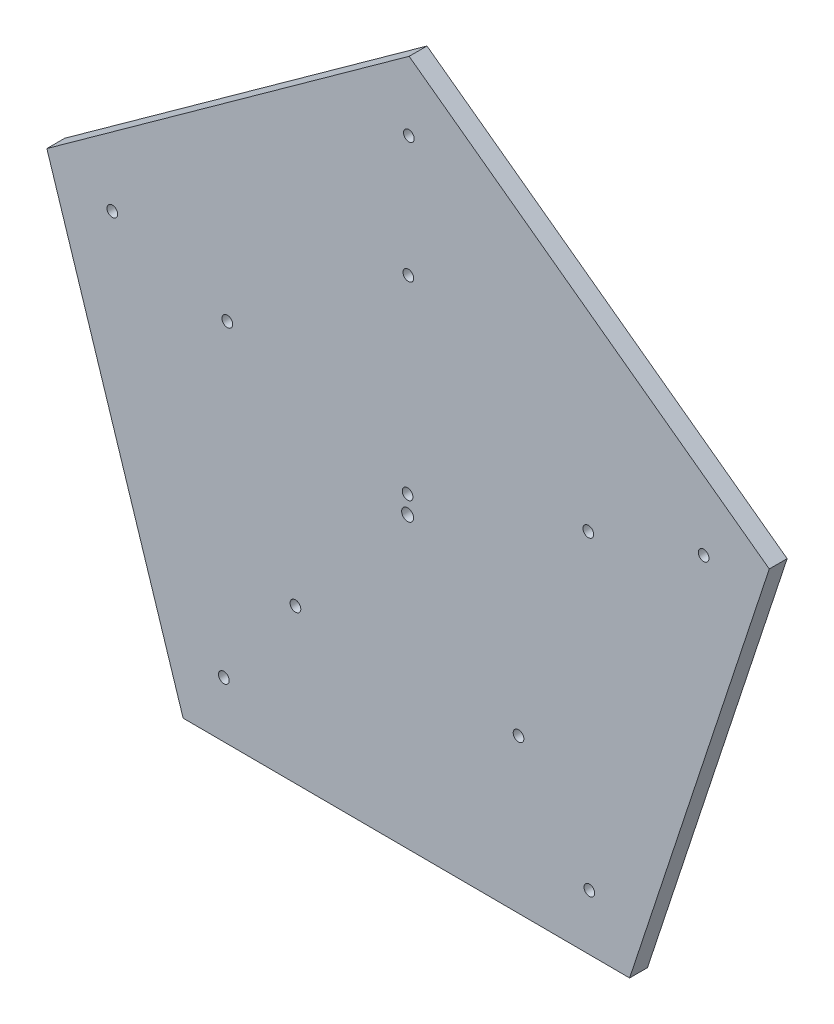
ISO-10303-21;
HEADER;
FILE_DESCRIPTION(('STEP AP214'),'2;1');
FILE_NAME('part.step','',(''),(''),'','','');
FILE_SCHEMA(('AUTOMOTIVE_DESIGN { 1 0 10303 214 1 1 1 1 }'));
ENDSEC;
DATA;
#1=APPLICATION_CONTEXT('core data for automotive mechanical design processes');
#2=APPLICATION_PROTOCOL_DEFINITION('international standard','automotive_design',2000,#1);
#3=PRODUCT_CONTEXT('',#1,'mechanical');
#4=PRODUCT('Part','Part','',(#3));
#5=PRODUCT_RELATED_PRODUCT_CATEGORY('part','',(#4));
#6=PRODUCT_DEFINITION_FORMATION('','',#4);
#7=PRODUCT_DEFINITION_CONTEXT('part definition',#1,'design');
#8=PRODUCT_DEFINITION('design','',#6,#7);
#9=PRODUCT_DEFINITION_SHAPE('','',#8);
#10=(LENGTH_UNIT() NAMED_UNIT(*) SI_UNIT(.MILLI.,.METRE.));
#11=(NAMED_UNIT(*) PLANE_ANGLE_UNIT() SI_UNIT($,.RADIAN.));
#12=(NAMED_UNIT(*) SI_UNIT($,.STERADIAN.) SOLID_ANGLE_UNIT());
#13=UNCERTAINTY_MEASURE_WITH_UNIT(LENGTH_MEASURE(1.E-05),#10,'distance_accuracy_value','');
#14=(GEOMETRIC_REPRESENTATION_CONTEXT(3) GLOBAL_UNCERTAINTY_ASSIGNED_CONTEXT((#13)) GLOBAL_UNIT_ASSIGNED_CONTEXT((#10,
#11,#12)) REPRESENTATION_CONTEXT('',''));
#15=CARTESIAN_POINT('',(0.,0.,0.));
#16=DIRECTION('',(0.,0.,1.));
#17=DIRECTION('',(1.,0.,0.));
#18=AXIS2_PLACEMENT_3D('',#15,#16,#17);
#19=CARTESIAN_POINT('',(60.7551531087886,19.4721535491955,3.));
#20=DIRECTION('',(-0.591017363980499,-0.806658834621888,0.));
#21=DIRECTION('',(0.806658834621888,-0.591017363980499,0.));
#22=AXIS2_PLACEMENT_3D('',#19,#20,#21);
#23=PLANE('',#22);
#24=DIRECTION('',(-0.806658834621888,0.591017363980499,0.));
#25=VECTOR('',#24,1.);
#26=CARTESIAN_POINT('',(60.7551531087886,19.4721535491955,0.));
#27=LINE('',#26,#25);
#28=CARTESIAN_POINT('',(60.7551531087886,19.4721535491955,0.));
#29=VERTEX_POINT('',#28);
#30=CARTESIAN_POINT('',(0.255256287205411,63.798810626403,0.));
#31=VERTEX_POINT('',#30);
#32=EDGE_CURVE('E107',#29,#31,#27,.T.);
#33=ORIENTED_EDGE('',*,*,#32,.T.);
#34=DIRECTION('',(0.,0.,-1.));
#35=VECTOR('',#34,1.);
#36=CARTESIAN_POINT('',(0.255256287205411,63.798810626403,3.));
#37=LINE('',#36,#35);
#38=CARTESIAN_POINT('',(0.255256287205411,63.798810626403,3.));
#39=VERTEX_POINT('',#38);
#40=EDGE_CURVE('E11',#39,#31,#37,.T.);
#41=ORIENTED_EDGE('',*,*,#40,.F.);
#42=DIRECTION('',(-0.806658834621888,0.591017363980499,0.));
#43=VECTOR('',#42,1.);
#44=CARTESIAN_POINT('',(60.7551531087886,19.4721535491955,3.));
#45=LINE('',#44,#43);
#46=CARTESIAN_POINT('',(60.7551531087886,19.4721535491955,3.));
#47=VERTEX_POINT('',#46);
#48=EDGE_CURVE('E116',#47,#39,#45,.T.);
#49=ORIENTED_EDGE('',*,*,#48,.F.);
#50=DIRECTION('',(0.,0.,-1.));
#51=VECTOR('',#50,1.);
#52=CARTESIAN_POINT('',(60.7551531087886,19.4721535491955,3.));
#53=LINE('',#52,#51);
#54=EDGE_CURVE('E103',#47,#29,#53,.T.);
#55=ORIENTED_EDGE('',*,*,#54,.T.);
#56=EDGE_LOOP('',(#33,#41,#49,#55));
#57=FACE_BOUND('',#56,.T.);
#58=ADVANCED_FACE('F33',(#57),#23,.F.);
#59=CARTESIAN_POINT('',(0.255256287205411,63.798810626403,3.));
#60=DIRECTION('',(0.584543731653543,-0.811362203818092,0.));
#61=DIRECTION('',(0.811362203818092,0.584543731653543,0.));
#62=AXIS2_PLACEMENT_3D('',#59,#60,#61);
#63=PLANE('',#62);
#64=DIRECTION('',(-0.811362203818092,-0.584543731653543,0.));
#65=VECTOR('',#64,1.);
#66=CARTESIAN_POINT('',(0.255256287205411,63.798810626403,0.));
#67=LINE('',#66,#65);
#68=CARTESIAN_POINT('',(-60.5973960474535,19.9576798597395,0.));
#69=VERTEX_POINT('',#68);
#70=EDGE_CURVE('E110',#31,#69,#67,.T.);
#71=ORIENTED_EDGE('',*,*,#70,.T.);
#72=DIRECTION('',(0.,0.,-1.));
#73=VECTOR('',#72,1.);
#74=CARTESIAN_POINT('',(-60.5973960474535,19.9576798597395,3.));
#75=LINE('',#74,#73);
#76=CARTESIAN_POINT('',(-60.5973960474535,19.9576798597395,3.));
#77=VERTEX_POINT('',#76);
#78=EDGE_CURVE('E41',#77,#69,#75,.T.);
#79=ORIENTED_EDGE('',*,*,#78,.F.);
#80=DIRECTION('',(-0.811362203818092,-0.584543731653543,0.));
#81=VECTOR('',#80,1.);
#82=CARTESIAN_POINT('',(0.255256287205411,63.798810626403,3.));
#83=LINE('',#82,#81);
#84=EDGE_CURVE('E83',#39,#77,#83,.T.);
#85=ORIENTED_EDGE('',*,*,#84,.F.);
#86=ORIENTED_EDGE('',*,*,#40,.T.);
#87=EDGE_LOOP('',(#71,#79,#85,#86));
#88=FACE_BOUND('',#87,.T.);
#89=ADVANCED_FACE('F137',(#88),#63,.F.);
#90=CARTESIAN_POINT('',(-60.5973960474535,19.9576798597395,3.));
#91=DIRECTION('',(0.952285258053086,0.305209415475287,0.));
#92=DIRECTION('',(-0.305209415475287,0.952285258053086,0.));
#93=AXIS2_PLACEMENT_3D('',#90,#91,#92);
#94=PLANE('',#93);
#95=DIRECTION('',(0.305209415475287,-0.952285258053087,0.));
#96=VECTOR('',#95,1.);
#97=CARTESIAN_POINT('',(-60.5973960474535,19.9576798597395,0.));
#98=LINE('',#97,#96);
#99=CARTESIAN_POINT('',(-37.7065066742702,-51.4642861364947,0.));
#100=VERTEX_POINT('',#99);
#101=EDGE_CURVE('E98',#69,#100,#98,.T.);
#102=ORIENTED_EDGE('',*,*,#101,.T.);
#103=DIRECTION('',(0.,0.,-1.));
#104=VECTOR('',#103,1.);
#105=CARTESIAN_POINT('',(-37.7065066742702,-51.4642861364947,3.));
#106=LINE('',#105,#104);
#107=CARTESIAN_POINT('',(-37.7065066742702,-51.4642861364947,3.));
#108=VERTEX_POINT('',#107);
#109=EDGE_CURVE('E95',#108,#100,#106,.T.);
#110=ORIENTED_EDGE('',*,*,#109,.F.);
#111=DIRECTION('',(0.305209415475287,-0.952285258053087,0.));
#112=VECTOR('',#111,1.);
#113=CARTESIAN_POINT('',(-60.5973960474535,19.9576798597395,3.));
#114=LINE('',#113,#112);
#115=EDGE_CURVE('E87',#77,#108,#114,.T.);
#116=ORIENTED_EDGE('',*,*,#115,.F.);
#117=ORIENTED_EDGE('',*,*,#78,.T.);
#118=EDGE_LOOP('',(#102,#110,#116,#117));
#119=FACE_BOUND('',#118,.T.);
#120=ADVANCED_FACE('F96',(#119),#94,.F.);
#121=CARTESIAN_POINT('',(-37.7065066742702,-51.4642861364947,3.));
#122=DIRECTION('',(0.00400092480872921,0.999991996268307,0.));
#123=DIRECTION('',(-0.999991996268308,0.00400092480872921,0.));
#124=AXIS2_PLACEMENT_3D('',#121,#122,#123);
#125=PLANE('',#124);
#126=DIRECTION('',(0.999991996268307,-0.00400092480872921,0.));
#127=VECTOR('',#126,1.);
#128=CARTESIAN_POINT('',(-37.7065066742702,-51.4642861364947,0.));
#129=LINE('',#128,#127);
#130=CARTESIAN_POINT('',(37.2934933257298,-51.7643578988433,0.));
#131=VERTEX_POINT('',#130);
#132=EDGE_CURVE('E69',#100,#131,#129,.T.);
#133=ORIENTED_EDGE('',*,*,#132,.T.);
#134=DIRECTION('',(0.,0.,-1.));
#135=VECTOR('',#134,1.);
#136=CARTESIAN_POINT('',(37.2934933257298,-51.7643578988433,3.));
#137=LINE('',#136,#135);
#138=CARTESIAN_POINT('',(37.2934933257298,-51.7643578988433,3.));
#139=VERTEX_POINT('',#138);
#140=EDGE_CURVE('E99',#139,#131,#137,.T.);
#141=ORIENTED_EDGE('',*,*,#140,.F.);
#142=DIRECTION('',(0.999991996268307,-0.00400092480872921,0.));
#143=VECTOR('',#142,1.);
#144=CARTESIAN_POINT('',(-37.7065066742702,-51.4642861364947,3.));
#145=LINE('',#144,#143);
#146=EDGE_CURVE('E91',#108,#139,#145,.T.);
#147=ORIENTED_EDGE('',*,*,#146,.F.);
#148=ORIENTED_EDGE('',*,*,#109,.T.);
#149=EDGE_LOOP('',(#133,#141,#147,#148));
#150=FACE_BOUND('',#149,.T.);
#151=ADVANCED_FACE('F101',(#150),#125,.F.);
#152=CARTESIAN_POINT('',(37.2934933257298,-51.7643578988433,3.));
#153=DIRECTION('',(-0.949812550534859,0.312819626696385,0.));
#154=DIRECTION('',(-0.312819626696385,-0.949812550534859,0.));
#155=AXIS2_PLACEMENT_3D('',#152,#153,#154);
#156=PLANE('',#155);
#157=DIRECTION('',(0.312819626696385,0.949812550534859,0.));
#158=VECTOR('',#157,1.);
#159=CARTESIAN_POINT('',(37.2934933257298,-51.7643578988433,0.));
#160=LINE('',#159,#158);
#161=EDGE_CURVE('E75',#131,#29,#160,.T.);
#162=ORIENTED_EDGE('',*,*,#161,.T.);
#163=ORIENTED_EDGE('',*,*,#54,.F.);
#164=DIRECTION('',(0.312819626696385,0.949812550534859,0.));
#165=VECTOR('',#164,1.);
#166=CARTESIAN_POINT('',(37.2934933257298,-51.7643578988433,3.));
#167=LINE('',#166,#165);
#168=EDGE_CURVE('E49',#139,#47,#167,.T.);
#169=ORIENTED_EDGE('',*,*,#168,.F.);
#170=ORIENTED_EDGE('',*,*,#140,.T.);
#171=EDGE_LOOP('',(#162,#163,#169,#170));
#172=FACE_BOUND('',#171,.T.);
#173=ADVANCED_FACE('F124',(#172),#156,.F.);
#174=CARTESIAN_POINT('',(0.,0.,3.));
#175=DIRECTION('',(0.,0.,1.));
#176=DIRECTION('',(1.,0.,0.));
#177=AXIS2_PLACEMENT_3D('',#174,#175,#176);
#178=PLANE('',#177);
#179=CARTESIAN_POINT('',(0.,-3.,3.));
#180=DIRECTION('',(0.,0.,-1.));
#181=DIRECTION('',(-1.,0.,0.));
#182=AXIS2_PLACEMENT_3D('',#179,#180,#181);
#183=CIRCLE('',#182,1.);
#184=CARTESIAN_POINT('',(-1.,-3.,3.));
#185=VERTEX_POINT('',#184);
#186=EDGE_CURVE('E291',#185,#185,#183,.T.);
#187=ORIENTED_EDGE('',*,*,#186,.T.);
#188=EDGE_LOOP('',(#187));
#189=FACE_BOUND('',#188,.T.);
#190=CARTESIAN_POINT('',(30.5267856348254,-42.3719881455068,3.));
#191=DIRECTION('',(0.,0.,1.));
#192=DIRECTION('',(0.309016994374945,0.951056516295155,0.));
#193=AXIS2_PLACEMENT_3D('',#190,#191,#192);
#194=CIRCLE('',#193,0.9);
#195=CARTESIAN_POINT('',(30.8049009297628,-41.5160372808412,3.));
#196=VERTEX_POINT('',#195);
#197=EDGE_CURVE('E303',#196,#196,#194,.T.);
#198=ORIENTED_EDGE('',*,*,#197,.F.);
#199=EDGE_LOOP('',(#198));
#200=FACE_BOUND('',#199,.T.);
#201=CARTESIAN_POINT('',(-30.2784703958275,9.97217798483106,3.));
#202=DIRECTION('',(0.,0.,1.));
#203=DIRECTION('',(0.309016994374958,-0.95105651629515,0.));
#204=AXIS2_PLACEMENT_3D('',#201,#202,#203);
#205=CIRCLE('',#204,0.900000000000001);
#206=CARTESIAN_POINT('',(-30.0003551008901,9.11622712016542,3.));
#207=VERTEX_POINT('',#206);
#208=EDGE_CURVE('E296',#207,#207,#205,.T.);
#209=ORIENTED_EDGE('',*,*,#208,.F.);
#210=EDGE_LOOP('',(#209));
#211=FACE_BOUND('',#210,.T.);
#212=CARTESIAN_POINT('',(-49.6023181044553,16.3364640991243,3.));
#213=DIRECTION('',(0.,0.,1.));
#214=DIRECTION('',(0.309016994374958,-0.95105651629515,0.));
#215=AXIS2_PLACEMENT_3D('',#212,#213,#214);
#216=CIRCLE('',#215,0.9);
#217=CARTESIAN_POINT('',(-49.3242028095178,15.4805132344587,3.));
#218=VERTEX_POINT('',#217);
#219=EDGE_CURVE('E317',#218,#218,#216,.T.);
#220=ORIENTED_EDGE('',*,*,#219,.F.);
#221=EDGE_LOOP('',(#220));
#222=FACE_BOUND('',#221,.T.);
#223=CARTESIAN_POINT('',(0.127542938139286,31.8781090416462,3.));
#224=DIRECTION('',(0.,0.,1.));
#225=DIRECTION('',(-0.809016994374942,-0.58778525229248,0.));
#226=AXIS2_PLACEMENT_3D('',#223,#224,#225);
#227=CIRCLE('',#226,0.900000000000001);
#228=CARTESIAN_POINT('',(-0.600572356798162,31.3491023145829,3.));
#229=VERTEX_POINT('',#228);
#230=EDGE_CURVE('E311',#229,#229,#227,.T.);
#231=ORIENTED_EDGE('',*,*,#230,.F.);
#232=EDGE_LOOP('',(#231));
#233=FACE_BOUND('',#232,.T.);
#234=CARTESIAN_POINT('',(18.6342979611836,-25.8648998213019,3.));
#235=DIRECTION('',(0.,0.,1.));
#236=DIRECTION('',(0.309016994374945,0.951056516295155,0.));
#237=AXIS2_PLACEMENT_3D('',#234,#235,#236);
#238=CIRCLE('',#237,0.900000000000001);
#239=CARTESIAN_POINT('',(18.9124132561211,-25.0089489566362,3.));
#240=VERTEX_POINT('',#239);
#241=EDGE_CURVE('E339',#240,#240,#238,.T.);
#242=ORIENTED_EDGE('',*,*,#241,.F.);
#243=EDGE_LOOP('',(#242));
#244=FACE_BOUND('',#243,.T.);
#245=CARTESIAN_POINT('',(49.7314509789673,15.9390339771307,3.));
#246=DIRECTION('',(0.,0.,1.));
#247=DIRECTION('',(-0.809016994374951,0.587785252292469,0.));
#248=AXIS2_PLACEMENT_3D('',#245,#246,#247);
#249=CIRCLE('',#248,0.9);
#250=CARTESIAN_POINT('',(49.0033356840298,16.4680407041939,3.));
#251=VERTEX_POINT('',#250);
#252=EDGE_CURVE('E328',#251,#251,#249,.T.);
#253=ORIENTED_EDGE('',*,*,#252,.F.);
#254=EDGE_LOOP('',(#253));
#255=FACE_BOUND('',#254,.T.);
#256=CARTESIAN_POINT('',(30.3572962666226,9.72957689998144,3.));
#257=DIRECTION('',(0.,0.,1.));
#258=DIRECTION('',(-0.809016994374951,0.587785252292469,0.));
#259=AXIS2_PLACEMENT_3D('',#256,#257,#258);
#260=CIRCLE('',#259,0.900000000000001);
#261=CARTESIAN_POINT('',(29.6291809716852,10.2585836270447,3.));
#262=VERTEX_POINT('',#261);
#263=EDGE_CURVE('E329',#262,#262,#260,.T.);
#264=ORIENTED_EDGE('',*,*,#263,.F.);
#265=EDGE_LOOP('',(#264));
#266=FACE_BOUND('',#265,.T.);
#267=CARTESIAN_POINT('',(0.208941380025352,52.2228528912129,3.));
#268=DIRECTION('',(0.,0.,1.));
#269=DIRECTION('',(-0.809016994374942,-0.58778525229248,0.));
#270=AXIS2_PLACEMENT_3D('',#267,#268,#269);
#271=CIRCLE('',#270,0.9);
#272=CARTESIAN_POINT('',(-0.519173914912096,51.6938461641496,3.));
#273=VERTEX_POINT('',#272);
#274=EDGE_CURVE('E310',#273,#273,#271,.T.);
#275=ORIENTED_EDGE('',*,*,#274,.F.);
#276=EDGE_LOOP('',(#275));
#277=FACE_BOUND('',#276,.T.);
#278=CARTESIAN_POINT('',(-30.8648598893633,-42.1263628219613,3.));
#279=DIRECTION('',(0.,0.,1.));
#280=DIRECTION('',(1.,0.,0.));
#281=AXIS2_PLACEMENT_3D('',#278,#279,#280);
#282=CIRCLE('',#281,0.9);
#283=CARTESIAN_POINT('',(-29.9648598893633,-42.1263628219613,3.));
#284=VERTEX_POINT('',#283);
#285=EDGE_CURVE('E351',#284,#284,#282,.T.);
#286=ORIENTED_EDGE('',*,*,#285,.F.);
#287=EDGE_LOOP('',(#286));
#288=FACE_BOUND('',#287,.T.);
#289=CARTESIAN_POINT('',(-18.8406667701184,-25.7149641051569,3.));
#290=DIRECTION('',(0.,0.,1.));
#291=DIRECTION('',(1.,0.,0.));
#292=AXIS2_PLACEMENT_3D('',#289,#290,#291);
#293=CIRCLE('',#292,0.900000000000001);
#294=CARTESIAN_POINT('',(-17.9406667701184,-25.7149641051569,3.));
#295=VERTEX_POINT('',#294);
#296=EDGE_CURVE('E354',#295,#295,#293,.T.);
#297=ORIENTED_EDGE('',*,*,#296,.F.);
#298=EDGE_LOOP('',(#297));
#299=FACE_BOUND('',#298,.T.);
#300=CARTESIAN_POINT('',(0.,0.,3.));
#301=DIRECTION('',(0.,0.,1.));
#302=DIRECTION('',(1.,0.,0.));
#303=AXIS2_PLACEMENT_3D('',#300,#301,#302);
#304=CIRCLE('',#303,0.9);
#305=CARTESIAN_POINT('',(0.9,0.,3.));
#306=VERTEX_POINT('',#305);
#307=EDGE_CURVE('E350',#306,#306,#304,.T.);
#308=ORIENTED_EDGE('',*,*,#307,.F.);
#309=EDGE_LOOP('',(#308));
#310=FACE_BOUND('',#309,.T.);
#311=ORIENTED_EDGE('',*,*,#48,.T.);
#312=ORIENTED_EDGE('',*,*,#84,.T.);
#313=ORIENTED_EDGE('',*,*,#115,.T.);
#314=ORIENTED_EDGE('',*,*,#146,.T.);
#315=ORIENTED_EDGE('',*,*,#168,.T.);
#316=EDGE_LOOP('',(#311,#312,#313,#314,#315));
#317=FACE_BOUND('',#316,.T.);
#318=ADVANCED_FACE('F89',(#189,#200,#211,#222,#233,#244,#255,#266,#277,#288,#299,#310,#317),
#178,.T.);
#319=CARTESIAN_POINT('',(0.,0.,0.));
#320=DIRECTION('',(0.,0.,1.));
#321=DIRECTION('',(1.,0.,0.));
#322=AXIS2_PLACEMENT_3D('',#319,#320,#321);
#323=PLANE('',#322);
#324=CARTESIAN_POINT('',(0.,-3.,0.));
#325=DIRECTION('',(0.,0.,-1.));
#326=DIRECTION('',(-1.,0.,0.));
#327=AXIS2_PLACEMENT_3D('',#324,#325,#326);
#328=CIRCLE('',#327,1.);
#329=CARTESIAN_POINT('',(-1.,-3.,0.));
#330=VERTEX_POINT('',#329);
#331=EDGE_CURVE('E294',#330,#330,#328,.T.);
#332=ORIENTED_EDGE('',*,*,#331,.F.);
#333=EDGE_LOOP('',(#332));
#334=FACE_BOUND('',#333,.T.);
#335=CARTESIAN_POINT('',(30.5267856348254,-42.3719881455068,0.));
#336=DIRECTION('',(0.,0.,1.));
#337=DIRECTION('',(0.309016994374945,0.951056516295155,0.));
#338=AXIS2_PLACEMENT_3D('',#335,#336,#337);
#339=CIRCLE('',#338,0.9);
#340=CARTESIAN_POINT('',(30.8049009297628,-41.5160372808412,0.));
#341=VERTEX_POINT('',#340);
#342=EDGE_CURVE('E299',#341,#341,#339,.T.);
#343=ORIENTED_EDGE('',*,*,#342,.T.);
#344=EDGE_LOOP('',(#343));
#345=FACE_BOUND('',#344,.T.);
#346=CARTESIAN_POINT('',(-30.2784703958275,9.97217798483106,0.));
#347=DIRECTION('',(0.,0.,1.));
#348=DIRECTION('',(0.309016994374958,-0.95105651629515,0.));
#349=AXIS2_PLACEMENT_3D('',#346,#347,#348);
#350=CIRCLE('',#349,0.900000000000001);
#351=CARTESIAN_POINT('',(-30.0003551008901,9.11622712016542,0.));
#352=VERTEX_POINT('',#351);
#353=EDGE_CURVE('E320',#352,#352,#350,.T.);
#354=ORIENTED_EDGE('',*,*,#353,.T.);
#355=EDGE_LOOP('',(#354));
#356=FACE_BOUND('',#355,.T.);
#357=CARTESIAN_POINT('',(-49.6023181044553,16.3364640991243,0.));
#358=DIRECTION('',(0.,0.,1.));
#359=DIRECTION('',(0.309016994374958,-0.95105651629515,0.));
#360=AXIS2_PLACEMENT_3D('',#357,#358,#359);
#361=CIRCLE('',#360,0.9);
#362=CARTESIAN_POINT('',(-49.3242028095178,15.4805132344587,0.));
#363=VERTEX_POINT('',#362);
#364=EDGE_CURVE('E314',#363,#363,#361,.T.);
#365=ORIENTED_EDGE('',*,*,#364,.T.);
#366=EDGE_LOOP('',(#365));
#367=FACE_BOUND('',#366,.T.);
#368=CARTESIAN_POINT('',(0.127542938139286,31.8781090416462,0.));
#369=DIRECTION('',(0.,0.,1.));
#370=DIRECTION('',(-0.809016994374942,-0.58778525229248,0.));
#371=AXIS2_PLACEMENT_3D('',#368,#369,#370);
#372=CIRCLE('',#371,0.900000000000001);
#373=CARTESIAN_POINT('',(-0.600572356798162,31.3491023145829,0.));
#374=VERTEX_POINT('',#373);
#375=EDGE_CURVE('E307',#374,#374,#372,.T.);
#376=ORIENTED_EDGE('',*,*,#375,.T.);
#377=EDGE_LOOP('',(#376));
#378=FACE_BOUND('',#377,.T.);
#379=CARTESIAN_POINT('',(18.6342979611836,-25.8648998213019,0.));
#380=DIRECTION('',(0.,0.,1.));
#381=DIRECTION('',(0.309016994374945,0.951056516295155,0.));
#382=AXIS2_PLACEMENT_3D('',#379,#380,#381);
#383=CIRCLE('',#382,0.900000000000001);
#384=CARTESIAN_POINT('',(18.9124132561211,-25.0089489566362,0.));
#385=VERTEX_POINT('',#384);
#386=EDGE_CURVE('E306',#385,#385,#383,.T.);
#387=ORIENTED_EDGE('',*,*,#386,.T.);
#388=EDGE_LOOP('',(#387));
#389=FACE_BOUND('',#388,.T.);
#390=CARTESIAN_POINT('',(49.7314509789673,15.9390339771307,0.));
#391=DIRECTION('',(0.,0.,1.));
#392=DIRECTION('',(-0.809016994374951,0.587785252292469,0.));
#393=AXIS2_PLACEMENT_3D('',#390,#391,#392);
#394=CIRCLE('',#393,0.9);
#395=CARTESIAN_POINT('',(49.0033356840298,16.4680407041939,0.));
#396=VERTEX_POINT('',#395);
#397=EDGE_CURVE('E342',#396,#396,#394,.T.);
#398=ORIENTED_EDGE('',*,*,#397,.T.);
#399=EDGE_LOOP('',(#398));
#400=FACE_BOUND('',#399,.T.);
#401=CARTESIAN_POINT('',(30.3572962666226,9.72957689998144,0.));
#402=DIRECTION('',(0.,0.,1.));
#403=DIRECTION('',(-0.809016994374951,0.587785252292469,0.));
#404=AXIS2_PLACEMENT_3D('',#401,#402,#403);
#405=CIRCLE('',#404,0.900000000000001);
#406=CARTESIAN_POINT('',(29.6291809716852,10.2585836270447,0.));
#407=VERTEX_POINT('',#406);
#408=EDGE_CURVE('E325',#407,#407,#405,.T.);
#409=ORIENTED_EDGE('',*,*,#408,.T.);
#410=EDGE_LOOP('',(#409));
#411=FACE_BOUND('',#410,.T.);
#412=CARTESIAN_POINT('',(0.208941380025352,52.2228528912129,0.));
#413=DIRECTION('',(0.,0.,1.));
#414=DIRECTION('',(-0.809016994374942,-0.58778525229248,0.));
#415=AXIS2_PLACEMENT_3D('',#412,#413,#414);
#416=CIRCLE('',#415,0.9);
#417=CARTESIAN_POINT('',(-0.519173914912096,51.6938461641496,0.));
#418=VERTEX_POINT('',#417);
#419=EDGE_CURVE('E332',#418,#418,#416,.T.);
#420=ORIENTED_EDGE('',*,*,#419,.T.);
#421=EDGE_LOOP('',(#420));
#422=FACE_BOUND('',#421,.T.);
#423=CARTESIAN_POINT('',(-30.8648598893633,-42.1263628219613,0.));
#424=DIRECTION('',(0.,0.,1.));
#425=DIRECTION('',(1.,0.,0.));
#426=AXIS2_PLACEMENT_3D('',#423,#424,#425);
#427=CIRCLE('',#426,0.9);
#428=CARTESIAN_POINT('',(-29.9648598893633,-42.1263628219613,0.));
#429=VERTEX_POINT('',#428);
#430=EDGE_CURVE('E347',#429,#429,#427,.T.);
#431=ORIENTED_EDGE('',*,*,#430,.T.);
#432=EDGE_LOOP('',(#431));
#433=FACE_BOUND('',#432,.T.);
#434=CARTESIAN_POINT('',(-18.8406667701184,-25.7149641051569,0.));
#435=DIRECTION('',(0.,0.,1.));
#436=DIRECTION('',(1.,0.,0.));
#437=AXIS2_PLACEMENT_3D('',#434,#435,#436);
#438=CIRCLE('',#437,0.900000000000001);
#439=CARTESIAN_POINT('',(-17.9406667701184,-25.7149641051569,0.));
#440=VERTEX_POINT('',#439);
#441=EDGE_CURVE('E302',#440,#440,#438,.T.);
#442=ORIENTED_EDGE('',*,*,#441,.T.);
#443=EDGE_LOOP('',(#442));
#444=FACE_BOUND('',#443,.T.);
#445=CARTESIAN_POINT('',(0.,0.,0.));
#446=DIRECTION('',(0.,0.,1.));
#447=DIRECTION('',(1.,0.,0.));
#448=AXIS2_PLACEMENT_3D('',#445,#446,#447);
#449=CIRCLE('',#448,0.9);
#450=CARTESIAN_POINT('',(0.9,0.,0.));
#451=VERTEX_POINT('',#450);
#452=EDGE_CURVE('E111',#451,#451,#449,.T.);
#453=ORIENTED_EDGE('',*,*,#452,.T.);
#454=EDGE_LOOP('',(#453));
#455=FACE_BOUND('',#454,.T.);
#456=ORIENTED_EDGE('',*,*,#32,.F.);
#457=ORIENTED_EDGE('',*,*,#161,.F.);
#458=ORIENTED_EDGE('',*,*,#132,.F.);
#459=ORIENTED_EDGE('',*,*,#101,.F.);
#460=ORIENTED_EDGE('',*,*,#70,.F.);
#461=EDGE_LOOP('',(#456,#457,#458,#459,#460));
#462=FACE_BOUND('',#461,.T.);
#463=ADVANCED_FACE('F120',(#334,#345,#356,#367,#378,#389,#400,#411,#422,#433,#444,#455,#462),
#323,.F.);
#464=CARTESIAN_POINT('',(0.,0.,0.));
#465=DIRECTION('',(0.,0.,1.));
#466=DIRECTION('',(1.,0.,0.));
#467=AXIS2_PLACEMENT_3D('',#464,#465,#466);
#468=CYLINDRICAL_SURFACE('',#467,0.9);
#469=ORIENTED_EDGE('',*,*,#452,.F.);
#470=EDGE_LOOP('',(#469));
#471=FACE_BOUND('',#470,.T.);
#472=ORIENTED_EDGE('',*,*,#307,.T.);
#473=EDGE_LOOP('',(#472));
#474=FACE_BOUND('',#473,.T.);
#475=ADVANCED_FACE('F161',(#471,#474),#468,.F.);
#476=CARTESIAN_POINT('',(-18.8406667701184,-25.7149641051569,0.));
#477=DIRECTION('',(0.,0.,1.));
#478=DIRECTION('',(1.,0.,0.));
#479=AXIS2_PLACEMENT_3D('',#476,#477,#478);
#480=CYLINDRICAL_SURFACE('',#479,0.900000000000001);
#481=ORIENTED_EDGE('',*,*,#441,.F.);
#482=EDGE_LOOP('',(#481));
#483=FACE_BOUND('',#482,.T.);
#484=ORIENTED_EDGE('',*,*,#296,.T.);
#485=EDGE_LOOP('',(#484));
#486=FACE_BOUND('',#485,.T.);
#487=ADVANCED_FACE('F166',(#483,#486),#480,.F.);
#488=CARTESIAN_POINT('',(-30.8648598893633,-42.1263628219613,0.));
#489=DIRECTION('',(0.,0.,1.));
#490=DIRECTION('',(1.,0.,0.));
#491=AXIS2_PLACEMENT_3D('',#488,#489,#490);
#492=CYLINDRICAL_SURFACE('',#491,0.9);
#493=ORIENTED_EDGE('',*,*,#430,.F.);
#494=EDGE_LOOP('',(#493));
#495=FACE_BOUND('',#494,.T.);
#496=ORIENTED_EDGE('',*,*,#285,.T.);
#497=EDGE_LOOP('',(#496));
#498=FACE_BOUND('',#497,.T.);
#499=ADVANCED_FACE('F178',(#495,#498),#492,.F.);
#500=CARTESIAN_POINT('',(0.208941380025352,52.2228528912129,0.));
#501=DIRECTION('',(0.,0.,1.));
#502=DIRECTION('',(1.,0.,0.));
#503=AXIS2_PLACEMENT_3D('',#500,#501,#502);
#504=CYLINDRICAL_SURFACE('',#503,0.9);
#505=ORIENTED_EDGE('',*,*,#419,.F.);
#506=EDGE_LOOP('',(#505));
#507=FACE_BOUND('',#506,.T.);
#508=ORIENTED_EDGE('',*,*,#274,.T.);
#509=EDGE_LOOP('',(#508));
#510=FACE_BOUND('',#509,.T.);
#511=ADVANCED_FACE('F188',(#507,#510),#504,.F.);
#512=CARTESIAN_POINT('',(30.3572962666226,9.72957689998144,0.));
#513=DIRECTION('',(0.,0.,1.));
#514=DIRECTION('',(1.,0.,0.));
#515=AXIS2_PLACEMENT_3D('',#512,#513,#514);
#516=CYLINDRICAL_SURFACE('',#515,0.900000000000001);
#517=ORIENTED_EDGE('',*,*,#408,.F.);
#518=EDGE_LOOP('',(#517));
#519=FACE_BOUND('',#518,.T.);
#520=ORIENTED_EDGE('',*,*,#263,.T.);
#521=EDGE_LOOP('',(#520));
#522=FACE_BOUND('',#521,.T.);
#523=ADVANCED_FACE('F198',(#519,#522),#516,.F.);
#524=CARTESIAN_POINT('',(49.7314509789673,15.9390339771307,0.));
#525=DIRECTION('',(0.,0.,1.));
#526=DIRECTION('',(1.,0.,0.));
#527=AXIS2_PLACEMENT_3D('',#524,#525,#526);
#528=CYLINDRICAL_SURFACE('',#527,0.9);
#529=ORIENTED_EDGE('',*,*,#397,.F.);
#530=EDGE_LOOP('',(#529));
#531=FACE_BOUND('',#530,.T.);
#532=ORIENTED_EDGE('',*,*,#252,.T.);
#533=EDGE_LOOP('',(#532));
#534=FACE_BOUND('',#533,.T.);
#535=ADVANCED_FACE('F208',(#531,#534),#528,.F.);
#536=CARTESIAN_POINT('',(18.6342979611836,-25.8648998213019,0.));
#537=DIRECTION('',(0.,0.,1.));
#538=DIRECTION('',(1.,0.,0.));
#539=AXIS2_PLACEMENT_3D('',#536,#537,#538);
#540=CYLINDRICAL_SURFACE('',#539,0.900000000000001);
#541=ORIENTED_EDGE('',*,*,#386,.F.);
#542=EDGE_LOOP('',(#541));
#543=FACE_BOUND('',#542,.T.);
#544=ORIENTED_EDGE('',*,*,#241,.T.);
#545=EDGE_LOOP('',(#544));
#546=FACE_BOUND('',#545,.T.);
#547=ADVANCED_FACE('F218',(#543,#546),#540,.F.);
#548=CARTESIAN_POINT('',(0.127542938139286,31.8781090416462,0.));
#549=DIRECTION('',(0.,0.,1.));
#550=DIRECTION('',(1.,0.,0.));
#551=AXIS2_PLACEMENT_3D('',#548,#549,#550);
#552=CYLINDRICAL_SURFACE('',#551,0.900000000000001);
#553=ORIENTED_EDGE('',*,*,#375,.F.);
#554=EDGE_LOOP('',(#553));
#555=FACE_BOUND('',#554,.T.);
#556=ORIENTED_EDGE('',*,*,#230,.T.);
#557=EDGE_LOOP('',(#556));
#558=FACE_BOUND('',#557,.T.);
#559=ADVANCED_FACE('F228',(#555,#558),#552,.F.);
#560=CARTESIAN_POINT('',(-49.6023181044553,16.3364640991243,0.));
#561=DIRECTION('',(0.,0.,1.));
#562=DIRECTION('',(1.,0.,0.));
#563=AXIS2_PLACEMENT_3D('',#560,#561,#562);
#564=CYLINDRICAL_SURFACE('',#563,0.9);
#565=ORIENTED_EDGE('',*,*,#364,.F.);
#566=EDGE_LOOP('',(#565));
#567=FACE_BOUND('',#566,.T.);
#568=ORIENTED_EDGE('',*,*,#219,.T.);
#569=EDGE_LOOP('',(#568));
#570=FACE_BOUND('',#569,.T.);
#571=ADVANCED_FACE('F238',(#567,#570),#564,.F.);
#572=CARTESIAN_POINT('',(-30.2784703958275,9.97217798483106,0.));
#573=DIRECTION('',(0.,0.,1.));
#574=DIRECTION('',(1.,0.,0.));
#575=AXIS2_PLACEMENT_3D('',#572,#573,#574);
#576=CYLINDRICAL_SURFACE('',#575,0.900000000000001);
#577=ORIENTED_EDGE('',*,*,#353,.F.);
#578=EDGE_LOOP('',(#577));
#579=FACE_BOUND('',#578,.T.);
#580=ORIENTED_EDGE('',*,*,#208,.T.);
#581=EDGE_LOOP('',(#580));
#582=FACE_BOUND('',#581,.T.);
#583=ADVANCED_FACE('F248',(#579,#582),#576,.F.);
#584=CARTESIAN_POINT('',(30.5267856348254,-42.3719881455068,0.));
#585=DIRECTION('',(0.,0.,1.));
#586=DIRECTION('',(1.,0.,0.));
#587=AXIS2_PLACEMENT_3D('',#584,#585,#586);
#588=CYLINDRICAL_SURFACE('',#587,0.9);
#589=ORIENTED_EDGE('',*,*,#342,.F.);
#590=EDGE_LOOP('',(#589));
#591=FACE_BOUND('',#590,.T.);
#592=ORIENTED_EDGE('',*,*,#197,.T.);
#593=EDGE_LOOP('',(#592));
#594=FACE_BOUND('',#593,.T.);
#595=ADVANCED_FACE('F258',(#591,#594),#588,.F.);
#596=CARTESIAN_POINT('',(0.,-3.,3.));
#597=DIRECTION('',(0.,0.,-1.));
#598=DIRECTION('',(-1.,0.,0.));
#599=AXIS2_PLACEMENT_3D('',#596,#597,#598);
#600=CYLINDRICAL_SURFACE('',#599,1.);
#601=ORIENTED_EDGE('',*,*,#186,.F.);
#602=EDGE_LOOP('',(#601));
#603=FACE_BOUND('',#602,.T.);
#604=ORIENTED_EDGE('',*,*,#331,.T.);
#605=EDGE_LOOP('',(#604));
#606=FACE_BOUND('',#605,.T.);
#607=ADVANCED_FACE('F267',(#603,#606),#600,.F.);
#608=CLOSED_SHELL('',(#58,#89,#120,#151,#173,#318,#463,#475,#487,#499,#511,#523,#535,#547,#559,
#571,#583,#595,#607));
#609=MANIFOLD_SOLID_BREP('B2',#608);
#610=ADVANCED_BREP_SHAPE_REPRESENTATION('',(#18,#609),#14);
#611=SHAPE_DEFINITION_REPRESENTATION(#9,#610);
ENDSEC;
END-ISO-10303-21;
